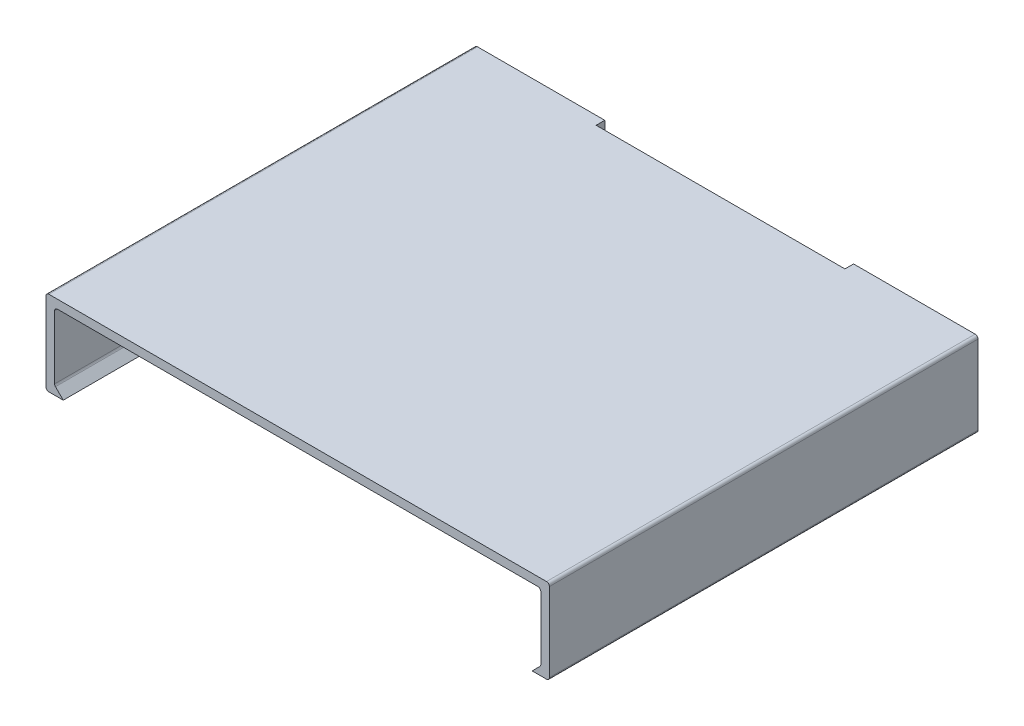
ISO-10303-21;
HEADER;
FILE_DESCRIPTION(('STEP AP214'),'2;1');
FILE_NAME('part.step','',(''),(''),'','','');
FILE_SCHEMA(('AUTOMOTIVE_DESIGN { 1 0 10303 214 1 1 1 1 }'));
ENDSEC;
DATA;
#1=APPLICATION_CONTEXT('core data for automotive mechanical design processes');
#2=APPLICATION_PROTOCOL_DEFINITION('international standard','automotive_design',2000,#1);
#3=PRODUCT_CONTEXT('',#1,'mechanical');
#4=PRODUCT('Part','Part','',(#3));
#5=PRODUCT_RELATED_PRODUCT_CATEGORY('part','',(#4));
#6=PRODUCT_DEFINITION_FORMATION('','',#4);
#7=PRODUCT_DEFINITION_CONTEXT('part definition',#1,'design');
#8=PRODUCT_DEFINITION('design','',#6,#7);
#9=PRODUCT_DEFINITION_SHAPE('','',#8);
#10=(LENGTH_UNIT() NAMED_UNIT(*) SI_UNIT(.MILLI.,.METRE.));
#11=(NAMED_UNIT(*) PLANE_ANGLE_UNIT() SI_UNIT($,.RADIAN.));
#12=(NAMED_UNIT(*) SI_UNIT($,.STERADIAN.) SOLID_ANGLE_UNIT());
#13=UNCERTAINTY_MEASURE_WITH_UNIT(LENGTH_MEASURE(1.E-05),#10,'distance_accuracy_value','');
#14=(GEOMETRIC_REPRESENTATION_CONTEXT(3) GLOBAL_UNCERTAINTY_ASSIGNED_CONTEXT((#13)) GLOBAL_UNIT_ASSIGNED_CONTEXT((#10,
#11,#12)) REPRESENTATION_CONTEXT('',''));
#15=CARTESIAN_POINT('',(0.,0.,0.));
#16=DIRECTION('',(0.,0.,1.));
#17=DIRECTION('',(1.,0.,0.));
#18=AXIS2_PLACEMENT_3D('',#15,#16,#17);
#19=CARTESIAN_POINT('',(18.3546894748456,10.8364269756994,74.5));
#20=DIRECTION('',(0.,1.,0.));
#21=DIRECTION('',(-1.,0.,0.));
#22=AXIS2_PLACEMENT_3D('',#19,#20,#21);
#23=PLANE('',#22);
#24=DIRECTION('',(1.,0.,0.));
#25=VECTOR('',#24,1.);
#26=CARTESIAN_POINT('',(18.3546894748456,10.8364269756994,0.));
#27=LINE('',#26,#25);
#28=CARTESIAN_POINT('',(-67.1453105251544,10.8364269756994,0.));
#29=VERTEX_POINT('',#28);
#30=CARTESIAN_POINT('',(-45.0203105251544,10.8364269756994,0.));
#31=VERTEX_POINT('',#30);
#32=EDGE_CURVE('E302',#29,#31,#27,.T.);
#33=ORIENTED_EDGE('',*,*,#32,.T.);
#34=DIRECTION('',(0.,0.,-1.));
#35=VECTOR('',#34,1.);
#36=CARTESIAN_POINT('',(-45.0203105251544,10.8364269756994,1.5));
#37=LINE('',#36,#35);
#38=CARTESIAN_POINT('',(-45.0203105251544,10.8364269756994,1.5));
#39=VERTEX_POINT('',#38);
#40=EDGE_CURVE('E218',#39,#31,#37,.T.);
#41=ORIENTED_EDGE('',*,*,#40,.F.);
#42=DIRECTION('',(1.,0.,0.));
#43=VECTOR('',#42,1.);
#44=CARTESIAN_POINT('',(-66.6453105251544,10.8364269756994,1.5));
#45=LINE('',#44,#43);
#46=CARTESIAN_POINT('',(-64.6453105251544,10.8364269756994,1.5));
#47=VERTEX_POINT('',#46);
#48=EDGE_CURVE('E226',#47,#39,#45,.T.);
#49=ORIENTED_EDGE('',*,*,#48,.F.);
#50=DIRECTION('',(0.,0.,-1.));
#51=VECTOR('',#50,1.);
#52=CARTESIAN_POINT('',(-64.6453105251544,10.8364269756994,74.5));
#53=LINE('',#52,#51);
#54=CARTESIAN_POINT('',(-64.6453105251544,10.8364269756994,74.5));
#55=VERTEX_POINT('',#54);
#56=EDGE_CURVE('E55',#55,#47,#53,.T.);
#57=ORIENTED_EDGE('',*,*,#56,.F.);
#58=DIRECTION('',(1.,0.,0.));
#59=VECTOR('',#58,1.);
#60=CARTESIAN_POINT('',(-66.1453105251544,10.8364269756994,74.5));
#61=LINE('',#60,#59);
#62=CARTESIAN_POINT('',(-67.1453105251544,10.8364269756994,74.5));
#63=VERTEX_POINT('',#62);
#64=EDGE_CURVE('E263',#63,#55,#61,.T.);
#65=ORIENTED_EDGE('',*,*,#64,.F.);
#66=DIRECTION('',(0.,0.,-1.));
#67=VECTOR('',#66,1.);
#68=CARTESIAN_POINT('',(-67.1453105251544,10.8364269756994,74.5));
#69=LINE('',#68,#67);
#70=EDGE_CURVE('E350',#63,#29,#69,.T.);
#71=ORIENTED_EDGE('',*,*,#70,.T.);
#72=EDGE_LOOP('',(#33,#41,#49,#57,#65,#71));
#73=FACE_BOUND('',#72,.T.);
#74=ADVANCED_FACE('F33',(#73),#23,.F.);
#75=CARTESIAN_POINT('',(19.3546894748456,25.0364269756994,0.));
#76=DIRECTION('',(0.,0.,1.));
#77=DIRECTION('',(1.,0.,0.));
#78=AXIS2_PLACEMENT_3D('',#75,#76,#77);
#79=PLANE('',#78);
#80=DIRECTION('',(-1.,0.,0.));
#81=VECTOR('',#80,1.);
#82=CARTESIAN_POINT('',(-66.1453105251544,25.5364269756994,0.));
#83=LINE('',#82,#81);
#84=CARTESIAN_POINT('',(-45.0203105251544,25.5364269756994,0.));
#85=VERTEX_POINT('',#84);
#86=CARTESIAN_POINT('',(-67.1453105251544,25.5364269756994,0.));
#87=VERTEX_POINT('',#86);
#88=EDGE_CURVE('E253',#85,#87,#83,.T.);
#89=ORIENTED_EDGE('',*,*,#88,.F.);
#90=DIRECTION('',(0.,1.,0.));
#91=VECTOR('',#90,1.);
#92=CARTESIAN_POINT('',(-45.0203105251544,10.8364269756994,0.));
#93=LINE('',#92,#91);
#94=EDGE_CURVE('E206',#31,#85,#93,.T.);
#95=ORIENTED_EDGE('',*,*,#94,.F.);
#96=ORIENTED_EDGE('',*,*,#32,.F.);
#97=CARTESIAN_POINT('',(-67.1453105251544,11.3364269756994,0.));
#98=DIRECTION('',(0.,0.,1.));
#99=DIRECTION('',(-1.,0.,0.));
#100=AXIS2_PLACEMENT_3D('',#97,#98,#99);
#101=CIRCLE('',#100,0.5);
#102=CARTESIAN_POINT('',(-67.6453105251544,11.3364269756994,0.));
#103=VERTEX_POINT('',#102);
#104=EDGE_CURVE('E298',#103,#29,#101,.T.);
#105=ORIENTED_EDGE('',*,*,#104,.F.);
#106=DIRECTION('',(0.,-1.,0.));
#107=VECTOR('',#106,1.);
#108=CARTESIAN_POINT('',(-67.6453105251544,25.0364269756994,0.));
#109=LINE('',#108,#107);
#110=CARTESIAN_POINT('',(-67.6453105251544,25.0364269756994,0.));
#111=VERTEX_POINT('',#110);
#112=EDGE_CURVE('E296',#111,#103,#109,.T.);
#113=ORIENTED_EDGE('',*,*,#112,.F.);
#114=CARTESIAN_POINT('',(-67.1453105251544,25.0364269756994,0.));
#115=DIRECTION('',(0.,0.,1.));
#116=DIRECTION('',(-1.,0.,0.));
#117=AXIS2_PLACEMENT_3D('',#114,#115,#116);
#118=CIRCLE('',#117,0.5);
#119=EDGE_CURVE('E294',#87,#111,#118,.T.);
#120=ORIENTED_EDGE('',*,*,#119,.F.);
#121=EDGE_LOOP('',(#89,#95,#96,#105,#113,#120));
#122=FACE_BOUND('',#121,.T.);
#123=ADVANCED_FACE('F368',(#122),#79,.F.);
#124=CARTESIAN_POINT('',(-66.6453105251544,10.8364269756994,1.5));
#125=DIRECTION('',(0.,0.,-1.));
#126=DIRECTION('',(-1.,0.,0.));
#127=AXIS2_PLACEMENT_3D('',#124,#125,#126);
#128=PLANE('',#127);
#129=ORIENTED_EDGE('',*,*,#48,.T.);
#130=DIRECTION('',(0.,1.,0.));
#131=VECTOR('',#130,1.);
#132=CARTESIAN_POINT('',(-45.0203105251544,10.8364269756994,1.5));
#133=LINE('',#132,#131);
#134=CARTESIAN_POINT('',(-45.0203105251544,24.0364269756994,1.5));
#135=VERTEX_POINT('',#134);
#136=EDGE_CURVE('E199',#39,#135,#133,.T.);
#137=ORIENTED_EDGE('',*,*,#136,.T.);
#138=DIRECTION('',(-1.,0.,0.));
#139=VECTOR('',#138,1.);
#140=CARTESIAN_POINT('',(-65.6453105251544,24.0364269756994,1.5));
#141=LINE('',#140,#139);
#142=CARTESIAN_POINT('',(-65.6453105251544,24.0364269756994,1.5));
#143=VERTEX_POINT('',#142);
#144=EDGE_CURVE('E238',#135,#143,#141,.T.);
#145=ORIENTED_EDGE('',*,*,#144,.T.);
#146=CARTESIAN_POINT('',(-65.6453105251544,23.5364269756994,1.5));
#147=DIRECTION('',(0.,0.,-1.));
#148=DIRECTION('',(-1.,0.,0.));
#149=AXIS2_PLACEMENT_3D('',#146,#147,#148);
#150=CIRCLE('',#149,0.5);
#151=CARTESIAN_POINT('',(-66.1453105251544,23.5364269756994,1.5));
#152=VERTEX_POINT('',#151);
#153=EDGE_CURVE('E242',#143,#152,#150,.F.);
#154=ORIENTED_EDGE('',*,*,#153,.T.);
#155=DIRECTION('',(0.,-1.,0.));
#156=VECTOR('',#155,1.);
#157=CARTESIAN_POINT('',(-66.1453105251544,23.5364269756994,1.5));
#158=LINE('',#157,#156);
#159=CARTESIAN_POINT('',(-66.1453105251544,12.543533756886,1.5));
#160=VERTEX_POINT('',#159);
#161=EDGE_CURVE('E245',#152,#160,#158,.T.);
#162=ORIENTED_EDGE('',*,*,#161,.T.);
#163=CARTESIAN_POINT('',(-65.6453105251544,12.543533756886,1.5));
#164=DIRECTION('',(0.,0.,-1.));
#165=DIRECTION('',(-1.,0.,0.));
#166=AXIS2_PLACEMENT_3D('',#163,#164,#165);
#167=CIRCLE('',#166,0.5);
#168=CARTESIAN_POINT('',(-65.9988639157477,12.1899803662927,1.5));
#169=VERTEX_POINT('',#168);
#170=EDGE_CURVE('E248',#160,#169,#167,.F.);
#171=ORIENTED_EDGE('',*,*,#170,.T.);
#172=DIRECTION('',(0.707106781186551,-0.707106781186544,0.));
#173=VECTOR('',#172,1.);
#174=CARTESIAN_POINT('',(-64.6453105251544,10.8364269756994,1.5));
#175=LINE('',#174,#173);
#176=EDGE_CURVE('E251',#169,#47,#175,.T.);
#177=ORIENTED_EDGE('',*,*,#176,.T.);
#178=EDGE_LOOP('',(#129,#137,#145,#154,#162,#171,#177));
#179=FACE_BOUND('',#178,.T.);
#180=ADVANCED_FACE('F425',(#179),#128,.F.);
#181=CARTESIAN_POINT('',(-64.6453105251544,10.8364269756994,74.5));
#182=DIRECTION('',(-0.707106781186544,-0.707106781186551,0.));
#183=DIRECTION('',(0.707106781186551,-0.707106781186544,0.));
#184=AXIS2_PLACEMENT_3D('',#181,#182,#183);
#185=PLANE('',#184);
#186=ORIENTED_EDGE('',*,*,#176,.F.);
#187=DIRECTION('',(0.,0.,-1.));
#188=VECTOR('',#187,1.);
#189=CARTESIAN_POINT('',(-65.9988639157477,12.1899803662927,74.5));
#190=LINE('',#189,#188);
#191=CARTESIAN_POINT('',(-65.9988639157477,12.1899803662927,74.5));
#192=VERTEX_POINT('',#191);
#193=EDGE_CURVE('E346',#192,#169,#190,.T.);
#194=ORIENTED_EDGE('',*,*,#193,.F.);
#195=DIRECTION('',(-0.707106781186551,0.707106781186544,0.));
#196=VECTOR('',#195,1.);
#197=CARTESIAN_POINT('',(-64.6453105251544,10.8364269756994,74.5));
#198=LINE('',#197,#196);
#199=EDGE_CURVE('E265',#55,#192,#198,.T.);
#200=ORIENTED_EDGE('',*,*,#199,.F.);
#201=ORIENTED_EDGE('',*,*,#56,.T.);
#202=EDGE_LOOP('',(#186,#194,#200,#201));
#203=FACE_BOUND('',#202,.T.);
#204=ADVANCED_FACE('F440',(#203),#185,.F.);
#205=CARTESIAN_POINT('',(-65.6453105251544,12.543533756886,74.5));
#206=DIRECTION('',(0.,0.,-1.));
#207=DIRECTION('',(-1.,0.,0.));
#208=AXIS2_PLACEMENT_3D('',#205,#206,#207);
#209=CYLINDRICAL_SURFACE('',#208,0.5);
#210=ORIENTED_EDGE('',*,*,#170,.F.);
#211=DIRECTION('',(0.,0.,-1.));
#212=VECTOR('',#211,1.);
#213=CARTESIAN_POINT('',(-66.1453105251544,12.543533756886,74.5));
#214=LINE('',#213,#212);
#215=CARTESIAN_POINT('',(-66.1453105251544,12.543533756886,74.5));
#216=VERTEX_POINT('',#215);
#217=EDGE_CURVE('E343',#216,#160,#214,.T.);
#218=ORIENTED_EDGE('',*,*,#217,.F.);
#219=CARTESIAN_POINT('',(-65.6453105251544,12.543533756886,74.5));
#220=DIRECTION('',(0.,0.,-1.));
#221=DIRECTION('',(-1.,0.,0.));
#222=AXIS2_PLACEMENT_3D('',#219,#220,#221);
#223=CIRCLE('',#222,0.5);
#224=EDGE_CURVE('E267',#192,#216,#223,.T.);
#225=ORIENTED_EDGE('',*,*,#224,.F.);
#226=ORIENTED_EDGE('',*,*,#193,.T.);
#227=EDGE_LOOP('',(#210,#218,#225,#226));
#228=FACE_BOUND('',#227,.T.);
#229=ADVANCED_FACE('F437',(#228),#209,.F.);
#230=CARTESIAN_POINT('',(-66.1453105251544,23.5364269756994,74.5));
#231=DIRECTION('',(-1.,0.,0.));
#232=DIRECTION('',(0.,0.,1.));
#233=AXIS2_PLACEMENT_3D('',#230,#231,#232);
#234=PLANE('',#233);
#235=ORIENTED_EDGE('',*,*,#161,.F.);
#236=DIRECTION('',(0.,0.,-1.));
#237=VECTOR('',#236,1.);
#238=CARTESIAN_POINT('',(-66.1453105251544,23.5364269756994,74.5));
#239=LINE('',#238,#237);
#240=CARTESIAN_POINT('',(-66.1453105251544,23.5364269756994,74.5));
#241=VERTEX_POINT('',#240);
#242=EDGE_CURVE('E340',#241,#152,#239,.T.);
#243=ORIENTED_EDGE('',*,*,#242,.F.);
#244=DIRECTION('',(0.,1.,0.));
#245=VECTOR('',#244,1.);
#246=CARTESIAN_POINT('',(-66.1453105251544,23.5364269756994,74.5));
#247=LINE('',#246,#245);
#248=EDGE_CURVE('E269',#216,#241,#247,.T.);
#249=ORIENTED_EDGE('',*,*,#248,.F.);
#250=ORIENTED_EDGE('',*,*,#217,.T.);
#251=EDGE_LOOP('',(#235,#243,#249,#250));
#252=FACE_BOUND('',#251,.T.);
#253=ADVANCED_FACE('F433',(#252),#234,.F.);
#254=CARTESIAN_POINT('',(-65.6453105251544,23.5364269756994,74.5));
#255=DIRECTION('',(0.,0.,-1.));
#256=DIRECTION('',(-1.,0.,0.));
#257=AXIS2_PLACEMENT_3D('',#254,#255,#256);
#258=CYLINDRICAL_SURFACE('',#257,0.5);
#259=ORIENTED_EDGE('',*,*,#153,.F.);
#260=DIRECTION('',(0.,0.,-1.));
#261=VECTOR('',#260,1.);
#262=CARTESIAN_POINT('',(-65.6453105251544,24.0364269756994,74.5));
#263=LINE('',#262,#261);
#264=CARTESIAN_POINT('',(-65.6453105251544,24.0364269756994,74.5));
#265=VERTEX_POINT('',#264);
#266=EDGE_CURVE('E337',#265,#143,#263,.T.);
#267=ORIENTED_EDGE('',*,*,#266,.F.);
#268=CARTESIAN_POINT('',(-65.6453105251544,23.5364269756994,74.5));
#269=DIRECTION('',(0.,0.,-1.));
#270=DIRECTION('',(-1.,0.,0.));
#271=AXIS2_PLACEMENT_3D('',#268,#269,#270);
#272=CIRCLE('',#271,0.5);
#273=EDGE_CURVE('E271',#241,#265,#272,.T.);
#274=ORIENTED_EDGE('',*,*,#273,.F.);
#275=ORIENTED_EDGE('',*,*,#242,.T.);
#276=EDGE_LOOP('',(#259,#267,#274,#275));
#277=FACE_BOUND('',#276,.T.);
#278=ADVANCED_FACE('F428',(#277),#258,.F.);
#279=CARTESIAN_POINT('',(-65.6453105251544,24.0364269756994,74.5));
#280=DIRECTION('',(0.,1.,0.));
#281=DIRECTION('',(0.,0.,1.));
#282=AXIS2_PLACEMENT_3D('',#279,#280,#281);
#283=PLANE('',#282);
#284=CARTESIAN_POINT('',(17.8546894748456,24.0364269756994,1.5));
#285=VERTEX_POINT('',#284);
#286=CARTESIAN_POINT('',(-1.77031052515439,24.0364269756994,1.5));
#287=VERTEX_POINT('',#286);
#288=EDGE_CURVE('E239',#285,#287,#141,.T.);
#289=ORIENTED_EDGE('',*,*,#288,.F.);
#290=DIRECTION('',(0.,0.,-1.));
#291=VECTOR('',#290,1.);
#292=CARTESIAN_POINT('',(17.8546894748456,24.0364269756994,74.5));
#293=LINE('',#292,#291);
#294=CARTESIAN_POINT('',(17.8546894748456,24.0364269756994,74.5));
#295=VERTEX_POINT('',#294);
#296=EDGE_CURVE('E334',#295,#285,#293,.T.);
#297=ORIENTED_EDGE('',*,*,#296,.F.);
#298=DIRECTION('',(1.,0.,0.));
#299=VECTOR('',#298,1.);
#300=CARTESIAN_POINT('',(-65.6453105251544,24.0364269756994,74.5));
#301=LINE('',#300,#299);
#302=EDGE_CURVE('E273',#265,#295,#301,.T.);
#303=ORIENTED_EDGE('',*,*,#302,.F.);
#304=ORIENTED_EDGE('',*,*,#266,.T.);
#305=ORIENTED_EDGE('',*,*,#144,.F.);
#306=EDGE_CURVE('E196',#287,#135,#141,.T.);
#307=ORIENTED_EDGE('',*,*,#306,.F.);
#308=EDGE_LOOP('',(#289,#297,#303,#304,#305,#307));
#309=FACE_BOUND('',#308,.T.);
#310=ADVANCED_FACE('F421',(#309),#283,.F.);
#311=CARTESIAN_POINT('',(17.8546894748456,23.5364269756994,74.5));
#312=DIRECTION('',(0.,0.,-1.));
#313=DIRECTION('',(-1.,0.,0.));
#314=AXIS2_PLACEMENT_3D('',#311,#312,#313);
#315=CYLINDRICAL_SURFACE('',#314,0.5);
#316=CARTESIAN_POINT('',(17.8546894748456,23.5364269756994,1.5));
#317=DIRECTION('',(0.,0.,-1.));
#318=DIRECTION('',(-1.,0.,0.));
#319=AXIS2_PLACEMENT_3D('',#316,#317,#318);
#320=CIRCLE('',#319,0.5);
#321=CARTESIAN_POINT('',(18.3546894748456,23.5364269756994,1.5));
#322=VERTEX_POINT('',#321);
#323=EDGE_CURVE('E235',#322,#285,#320,.F.);
#324=ORIENTED_EDGE('',*,*,#323,.F.);
#325=DIRECTION('',(0.,0.,-1.));
#326=VECTOR('',#325,1.);
#327=CARTESIAN_POINT('',(18.3546894748456,23.5364269756994,74.5));
#328=LINE('',#327,#326);
#329=CARTESIAN_POINT('',(18.3546894748456,23.5364269756994,74.5));
#330=VERTEX_POINT('',#329);
#331=EDGE_CURVE('E331',#330,#322,#328,.T.);
#332=ORIENTED_EDGE('',*,*,#331,.F.);
#333=CARTESIAN_POINT('',(17.8546894748456,23.5364269756994,74.5));
#334=DIRECTION('',(0.,0.,-1.));
#335=DIRECTION('',(-1.,0.,0.));
#336=AXIS2_PLACEMENT_3D('',#333,#334,#335);
#337=CIRCLE('',#336,0.5);
#338=EDGE_CURVE('E275',#295,#330,#337,.T.);
#339=ORIENTED_EDGE('',*,*,#338,.F.);
#340=ORIENTED_EDGE('',*,*,#296,.T.);
#341=EDGE_LOOP('',(#324,#332,#339,#340));
#342=FACE_BOUND('',#341,.T.);
#343=ADVANCED_FACE('F417',(#342),#315,.F.);
#344=CARTESIAN_POINT('',(18.3546894748456,23.5364269756994,74.5));
#345=DIRECTION('',(1.,0.,0.));
#346=DIRECTION('',(0.,1.,0.));
#347=AXIS2_PLACEMENT_3D('',#344,#345,#346);
#348=PLANE('',#347);
#349=DIRECTION('',(0.,1.,0.));
#350=VECTOR('',#349,1.);
#351=CARTESIAN_POINT('',(18.3546894748456,10.8364269756995,1.5));
#352=LINE('',#351,#350);
#353=CARTESIAN_POINT('',(18.3546894748456,12.543533756886,1.5));
#354=VERTEX_POINT('',#353);
#355=EDGE_CURVE('E220',#354,#322,#352,.T.);
#356=ORIENTED_EDGE('',*,*,#355,.F.);
#357=DIRECTION('',(0.,0.,-1.));
#358=VECTOR('',#357,1.);
#359=CARTESIAN_POINT('',(18.3546894748456,12.543533756886,74.5));
#360=LINE('',#359,#358);
#361=CARTESIAN_POINT('',(18.3546894748456,12.543533756886,74.5));
#362=VERTEX_POINT('',#361);
#363=EDGE_CURVE('E328',#362,#354,#360,.T.);
#364=ORIENTED_EDGE('',*,*,#363,.F.);
#365=DIRECTION('',(0.,-1.,0.));
#366=VECTOR('',#365,1.);
#367=CARTESIAN_POINT('',(18.3546894748456,23.5364269756994,74.5));
#368=LINE('',#367,#366);
#369=EDGE_CURVE('E277',#330,#362,#368,.T.);
#370=ORIENTED_EDGE('',*,*,#369,.F.);
#371=ORIENTED_EDGE('',*,*,#331,.T.);
#372=EDGE_LOOP('',(#356,#364,#370,#371));
#373=FACE_BOUND('',#372,.T.);
#374=ADVANCED_FACE('F412',(#373),#348,.F.);
#375=CARTESIAN_POINT('',(17.8546894748456,12.543533756886,74.5));
#376=DIRECTION('',(0.,0.,-1.));
#377=DIRECTION('',(-1.,0.,0.));
#378=AXIS2_PLACEMENT_3D('',#375,#376,#377);
#379=CYLINDRICAL_SURFACE('',#378,0.500000000000002);
#380=CARTESIAN_POINT('',(17.8546894748456,12.543533756886,1.5));
#381=DIRECTION('',(0.,0.,-1.));
#382=DIRECTION('',(-1.,0.,0.));
#383=AXIS2_PLACEMENT_3D('',#380,#381,#382);
#384=CIRCLE('',#383,0.500000000000002);
#385=CARTESIAN_POINT('',(18.2082428654389,12.1899803662927,1.5));
#386=VERTEX_POINT('',#385);
#387=EDGE_CURVE('E232',#386,#354,#384,.F.);
#388=ORIENTED_EDGE('',*,*,#387,.F.);
#389=DIRECTION('',(0.,0.,-1.));
#390=VECTOR('',#389,1.);
#391=CARTESIAN_POINT('',(18.2082428654389,12.1899803662927,74.5));
#392=LINE('',#391,#390);
#393=CARTESIAN_POINT('',(18.2082428654389,12.1899803662927,74.5));
#394=VERTEX_POINT('',#393);
#395=EDGE_CURVE('E325',#394,#386,#392,.T.);
#396=ORIENTED_EDGE('',*,*,#395,.F.);
#397=CARTESIAN_POINT('',(17.8546894748456,12.543533756886,74.5));
#398=DIRECTION('',(0.,0.,-1.));
#399=DIRECTION('',(1.,0.,0.));
#400=AXIS2_PLACEMENT_3D('',#397,#398,#399);
#401=CIRCLE('',#400,0.500000000000002);
#402=EDGE_CURVE('E279',#362,#394,#401,.T.);
#403=ORIENTED_EDGE('',*,*,#402,.F.);
#404=ORIENTED_EDGE('',*,*,#363,.T.);
#405=EDGE_LOOP('',(#388,#396,#403,#404));
#406=FACE_BOUND('',#405,.T.);
#407=ADVANCED_FACE('F409',(#406),#379,.F.);
#408=CARTESIAN_POINT('',(16.8546894748456,10.8364269756994,74.5));
#409=DIRECTION('',(0.70710678118655,-0.707106781186545,0.));
#410=DIRECTION('',(0.707106781186545,0.70710678118655,0.));
#411=AXIS2_PLACEMENT_3D('',#408,#409,#410);
#412=PLANE('',#411);
#413=DIRECTION('',(0.707106781186545,0.70710678118655,0.));
#414=VECTOR('',#413,1.);
#415=CARTESIAN_POINT('',(16.8546894748456,10.8364269756994,1.5));
#416=LINE('',#415,#414);
#417=CARTESIAN_POINT('',(16.8546894748456,10.8364269756994,1.5));
#418=VERTEX_POINT('',#417);
#419=EDGE_CURVE('E229',#418,#386,#416,.T.);
#420=ORIENTED_EDGE('',*,*,#419,.F.);
#421=DIRECTION('',(0.,0.,-1.));
#422=VECTOR('',#421,1.);
#423=CARTESIAN_POINT('',(16.8546894748456,10.8364269756994,74.5));
#424=LINE('',#423,#422);
#425=CARTESIAN_POINT('',(16.8546894748456,10.8364269756994,74.5));
#426=VERTEX_POINT('',#425);
#427=EDGE_CURVE('E322',#426,#418,#424,.T.);
#428=ORIENTED_EDGE('',*,*,#427,.F.);
#429=DIRECTION('',(-0.707106781186545,-0.70710678118655,0.));
#430=VECTOR('',#429,1.);
#431=CARTESIAN_POINT('',(16.8546894748456,10.8364269756994,74.5));
#432=LINE('',#431,#430);
#433=EDGE_CURVE('E281',#394,#426,#432,.T.);
#434=ORIENTED_EDGE('',*,*,#433,.F.);
#435=ORIENTED_EDGE('',*,*,#395,.T.);
#436=EDGE_LOOP('',(#420,#428,#434,#435));
#437=FACE_BOUND('',#436,.T.);
#438=ADVANCED_FACE('F404',(#437),#412,.F.);
#439=CARTESIAN_POINT('',(-66.1453105251544,25.5364269756994,74.5));
#440=DIRECTION('',(0.,-1.,0.));
#441=DIRECTION('',(0.,0.,-1.));
#442=AXIS2_PLACEMENT_3D('',#439,#440,#441);
#443=PLANE('',#442);
#444=DIRECTION('',(1.,0.,0.));
#445=VECTOR('',#444,1.);
#446=CARTESIAN_POINT('',(-45.0203105251544,25.5364269756994,1.5));
#447=LINE('',#446,#445);
#448=CARTESIAN_POINT('',(-45.0203105251544,25.5364269756994,1.5));
#449=VERTEX_POINT('',#448);
#450=CARTESIAN_POINT('',(-1.77031052515439,25.5364269756994,1.5));
#451=VERTEX_POINT('',#450);
#452=EDGE_CURVE('E193',#449,#451,#447,.T.);
#453=ORIENTED_EDGE('',*,*,#452,.F.);
#454=DIRECTION('',(0.,0.,-1.));
#455=VECTOR('',#454,1.);
#456=CARTESIAN_POINT('',(-45.0203105251544,25.5364269756994,1.5));
#457=LINE('',#456,#455);
#458=EDGE_CURVE('E203',#449,#85,#457,.T.);
#459=ORIENTED_EDGE('',*,*,#458,.T.);
#460=ORIENTED_EDGE('',*,*,#88,.T.);
#461=DIRECTION('',(0.,0.,-1.));
#462=VECTOR('',#461,1.);
#463=CARTESIAN_POINT('',(-67.1453105251544,25.5364269756994,74.5));
#464=LINE('',#463,#462);
#465=CARTESIAN_POINT('',(-67.1453105251544,25.5364269756994,74.5));
#466=VERTEX_POINT('',#465);
#467=EDGE_CURVE('E41',#466,#87,#464,.T.);
#468=ORIENTED_EDGE('',*,*,#467,.F.);
#469=DIRECTION('',(-1.,0.,0.));
#470=VECTOR('',#469,1.);
#471=CARTESIAN_POINT('',(18.3546894748456,25.5364269756994,74.5));
#472=LINE('',#471,#470);
#473=CARTESIAN_POINT('',(19.3546894748456,25.5364269756994,74.5));
#474=VERTEX_POINT('',#473);
#475=EDGE_CURVE('E254',#474,#466,#472,.T.);
#476=ORIENTED_EDGE('',*,*,#475,.F.);
#477=DIRECTION('',(0.,0.,-1.));
#478=VECTOR('',#477,1.);
#479=CARTESIAN_POINT('',(19.3546894748456,25.5364269756994,74.5));
#480=LINE('',#479,#478);
#481=CARTESIAN_POINT('',(19.3546894748456,25.5364269756994,0.));
#482=VERTEX_POINT('',#481);
#483=EDGE_CURVE('E291',#474,#482,#480,.T.);
#484=ORIENTED_EDGE('',*,*,#483,.T.);
#485=CARTESIAN_POINT('',(-1.77031052515439,25.5364269756994,0.));
#486=VERTEX_POINT('',#485);
#487=EDGE_CURVE('E292',#482,#486,#83,.T.);
#488=ORIENTED_EDGE('',*,*,#487,.T.);
#489=DIRECTION('',(0.,0.,-1.));
#490=VECTOR('',#489,1.);
#491=CARTESIAN_POINT('',(-1.77031052515439,25.5364269756994,1.5));
#492=LINE('',#491,#490);
#493=EDGE_CURVE('E209',#451,#486,#492,.T.);
#494=ORIENTED_EDGE('',*,*,#493,.F.);
#495=EDGE_LOOP('',(#453,#459,#460,#468,#476,#484,#488,#494));
#496=FACE_BOUND('',#495,.T.);
#497=ADVANCED_FACE('F35',(#496),#443,.F.);
#498=CARTESIAN_POINT('',(-67.1453105251544,25.0364269756994,74.5));
#499=DIRECTION('',(0.,0.,-1.));
#500=DIRECTION('',(-1.,0.,0.));
#501=AXIS2_PLACEMENT_3D('',#498,#499,#500);
#502=CYLINDRICAL_SURFACE('',#501,0.5);
#503=ORIENTED_EDGE('',*,*,#119,.T.);
#504=DIRECTION('',(0.,0.,-1.));
#505=VECTOR('',#504,1.);
#506=CARTESIAN_POINT('',(-67.6453105251544,25.0364269756994,74.5));
#507=LINE('',#506,#505);
#508=CARTESIAN_POINT('',(-67.6453105251544,25.0364269756994,74.5));
#509=VERTEX_POINT('',#508);
#510=EDGE_CURVE('E356',#509,#111,#507,.T.);
#511=ORIENTED_EDGE('',*,*,#510,.F.);
#512=CARTESIAN_POINT('',(-67.1453105251544,25.0364269756994,74.5));
#513=DIRECTION('',(0.,0.,1.));
#514=DIRECTION('',(-1.,0.,0.));
#515=AXIS2_PLACEMENT_3D('',#512,#513,#514);
#516=CIRCLE('',#515,0.5);
#517=EDGE_CURVE('E256',#466,#509,#516,.T.);
#518=ORIENTED_EDGE('',*,*,#517,.F.);
#519=ORIENTED_EDGE('',*,*,#467,.T.);
#520=EDGE_LOOP('',(#503,#511,#518,#519));
#521=FACE_BOUND('',#520,.T.);
#522=ADVANCED_FACE('F363',(#521),#502,.T.);
#523=CARTESIAN_POINT('',(-67.6453105251544,25.0364269756994,74.5));
#524=DIRECTION('',(1.,0.,0.));
#525=DIRECTION('',(0.,0.,-1.));
#526=AXIS2_PLACEMENT_3D('',#523,#524,#525);
#527=PLANE('',#526);
#528=ORIENTED_EDGE('',*,*,#112,.T.);
#529=DIRECTION('',(0.,0.,-1.));
#530=VECTOR('',#529,1.);
#531=CARTESIAN_POINT('',(-67.6453105251544,11.3364269756994,74.5));
#532=LINE('',#531,#530);
#533=CARTESIAN_POINT('',(-67.6453105251544,11.3364269756994,74.5));
#534=VERTEX_POINT('',#533);
#535=EDGE_CURVE('E353',#534,#103,#532,.T.);
#536=ORIENTED_EDGE('',*,*,#535,.F.);
#537=DIRECTION('',(0.,-1.,0.));
#538=VECTOR('',#537,1.);
#539=CARTESIAN_POINT('',(-67.6453105251544,25.0364269756994,74.5));
#540=LINE('',#539,#538);
#541=EDGE_CURVE('E259',#509,#534,#540,.T.);
#542=ORIENTED_EDGE('',*,*,#541,.F.);
#543=ORIENTED_EDGE('',*,*,#510,.T.);
#544=EDGE_LOOP('',(#528,#536,#542,#543));
#545=FACE_BOUND('',#544,.T.);
#546=ADVANCED_FACE('F372',(#545),#527,.F.);
#547=CARTESIAN_POINT('',(-67.1453105251544,11.3364269756994,74.5));
#548=DIRECTION('',(0.,0.,-1.));
#549=DIRECTION('',(-1.,0.,0.));
#550=AXIS2_PLACEMENT_3D('',#547,#548,#549);
#551=CYLINDRICAL_SURFACE('',#550,0.5);
#552=ORIENTED_EDGE('',*,*,#104,.T.);
#553=ORIENTED_EDGE('',*,*,#70,.F.);
#554=CARTESIAN_POINT('',(-67.1453105251544,11.3364269756994,74.5));
#555=DIRECTION('',(0.,0.,1.));
#556=DIRECTION('',(-1.,0.,0.));
#557=AXIS2_PLACEMENT_3D('',#554,#555,#556);
#558=CIRCLE('',#557,0.5);
#559=EDGE_CURVE('E261',#534,#63,#558,.T.);
#560=ORIENTED_EDGE('',*,*,#559,.F.);
#561=ORIENTED_EDGE('',*,*,#535,.T.);
#562=EDGE_LOOP('',(#552,#553,#560,#561));
#563=FACE_BOUND('',#562,.T.);
#564=ADVANCED_FACE('F376',(#563),#551,.T.);
#565=CARTESIAN_POINT('',(-1.77031052515439,10.8364269756995,1.5));
#566=VERTEX_POINT('',#565);
#567=EDGE_CURVE('E225',#566,#418,#45,.T.);
#568=ORIENTED_EDGE('',*,*,#567,.F.);
#569=DIRECTION('',(0.,0.,-1.));
#570=VECTOR('',#569,1.);
#571=CARTESIAN_POINT('',(-1.77031052515439,10.8364269756994,1.5));
#572=LINE('',#571,#570);
#573=CARTESIAN_POINT('',(-1.77031052515439,10.8364269756994,0.));
#574=VERTEX_POINT('',#573);
#575=EDGE_CURVE('E48',#566,#574,#572,.T.);
#576=ORIENTED_EDGE('',*,*,#575,.T.);
#577=CARTESIAN_POINT('',(19.3546894748456,10.8364269756994,0.));
#578=VERTEX_POINT('',#577);
#579=EDGE_CURVE('E301',#574,#578,#27,.T.);
#580=ORIENTED_EDGE('',*,*,#579,.T.);
#581=DIRECTION('',(0.,0.,-1.));
#582=VECTOR('',#581,1.);
#583=CARTESIAN_POINT('',(19.3546894748456,10.8364269756994,74.5));
#584=LINE('',#583,#582);
#585=CARTESIAN_POINT('',(19.3546894748456,10.8364269756994,74.5));
#586=VERTEX_POINT('',#585);
#587=EDGE_CURVE('E319',#586,#578,#584,.T.);
#588=ORIENTED_EDGE('',*,*,#587,.F.);
#589=DIRECTION('',(1.,0.,0.));
#590=VECTOR('',#589,1.);
#591=CARTESIAN_POINT('',(18.3546894748456,10.8364269756994,74.5));
#592=LINE('',#591,#590);
#593=EDGE_CURVE('E283',#426,#586,#592,.T.);
#594=ORIENTED_EDGE('',*,*,#593,.F.);
#595=ORIENTED_EDGE('',*,*,#427,.T.);
#596=EDGE_LOOP('',(#568,#576,#580,#588,#594,#595));
#597=FACE_BOUND('',#596,.T.);
#598=ADVANCED_FACE('F396',(#597),#23,.F.);
#599=CARTESIAN_POINT('',(19.3546894748456,11.3364269756994,74.5));
#600=DIRECTION('',(0.,0.,-1.));
#601=DIRECTION('',(-1.,0.,0.));
#602=AXIS2_PLACEMENT_3D('',#599,#600,#601);
#603=CYLINDRICAL_SURFACE('',#602,0.5);
#604=CARTESIAN_POINT('',(19.3546894748456,11.3364269756994,0.));
#605=DIRECTION('',(0.,0.,1.));
#606=DIRECTION('',(1.,0.,0.));
#607=AXIS2_PLACEMENT_3D('',#604,#605,#606);
#608=CIRCLE('',#607,0.5);
#609=CARTESIAN_POINT('',(19.8546894748456,11.3364269756994,0.));
#610=VERTEX_POINT('',#609);
#611=EDGE_CURVE('E305',#578,#610,#608,.T.);
#612=ORIENTED_EDGE('',*,*,#611,.T.);
#613=DIRECTION('',(0.,0.,-1.));
#614=VECTOR('',#613,1.);
#615=CARTESIAN_POINT('',(19.8546894748456,11.3364269756994,74.5));
#616=LINE('',#615,#614);
#617=CARTESIAN_POINT('',(19.8546894748456,11.3364269756994,74.5));
#618=VERTEX_POINT('',#617);
#619=EDGE_CURVE('E316',#618,#610,#616,.T.);
#620=ORIENTED_EDGE('',*,*,#619,.F.);
#621=CARTESIAN_POINT('',(19.3546894748456,11.3364269756994,74.5));
#622=DIRECTION('',(0.,0.,1.));
#623=DIRECTION('',(1.,0.,0.));
#624=AXIS2_PLACEMENT_3D('',#621,#622,#623);
#625=CIRCLE('',#624,0.5);
#626=EDGE_CURVE('E285',#586,#618,#625,.T.);
#627=ORIENTED_EDGE('',*,*,#626,.F.);
#628=ORIENTED_EDGE('',*,*,#587,.T.);
#629=EDGE_LOOP('',(#612,#620,#627,#628));
#630=FACE_BOUND('',#629,.T.);
#631=ADVANCED_FACE('F444',(#630),#603,.T.);
#632=CARTESIAN_POINT('',(19.8546894748456,25.0364269756994,74.5));
#633=DIRECTION('',(-1.,0.,0.));
#634=DIRECTION('',(0.,-1.,0.));
#635=AXIS2_PLACEMENT_3D('',#632,#633,#634);
#636=PLANE('',#635);
#637=DIRECTION('',(0.,1.,0.));
#638=VECTOR('',#637,1.);
#639=CARTESIAN_POINT('',(19.8546894748456,25.0364269756994,0.));
#640=LINE('',#639,#638);
#641=CARTESIAN_POINT('',(19.8546894748456,25.0364269756994,0.));
#642=VERTEX_POINT('',#641);
#643=EDGE_CURVE('E307',#610,#642,#640,.T.);
#644=ORIENTED_EDGE('',*,*,#643,.T.);
#645=DIRECTION('',(0.,0.,-1.));
#646=VECTOR('',#645,1.);
#647=CARTESIAN_POINT('',(19.8546894748456,25.0364269756994,74.5));
#648=LINE('',#647,#646);
#649=CARTESIAN_POINT('',(19.8546894748456,25.0364269756994,74.5));
#650=VERTEX_POINT('',#649);
#651=EDGE_CURVE('E313',#650,#642,#648,.T.);
#652=ORIENTED_EDGE('',*,*,#651,.F.);
#653=DIRECTION('',(0.,1.,0.));
#654=VECTOR('',#653,1.);
#655=CARTESIAN_POINT('',(19.8546894748456,25.0364269756994,74.5));
#656=LINE('',#655,#654);
#657=EDGE_CURVE('E287',#618,#650,#656,.T.);
#658=ORIENTED_EDGE('',*,*,#657,.F.);
#659=ORIENTED_EDGE('',*,*,#619,.T.);
#660=EDGE_LOOP('',(#644,#652,#658,#659));
#661=FACE_BOUND('',#660,.T.);
#662=ADVANCED_FACE('F447',(#661),#636,.F.);
#663=CARTESIAN_POINT('',(19.3546894748456,25.0364269756994,74.5));
#664=DIRECTION('',(0.,0.,-1.));
#665=DIRECTION('',(-1.,0.,0.));
#666=AXIS2_PLACEMENT_3D('',#663,#664,#665);
#667=CYLINDRICAL_SURFACE('',#666,0.5);
#668=CARTESIAN_POINT('',(19.3546894748456,25.0364269756994,0.));
#669=DIRECTION('',(0.,0.,1.));
#670=DIRECTION('',(1.,0.,0.));
#671=AXIS2_PLACEMENT_3D('',#668,#669,#670);
#672=CIRCLE('',#671,0.5);
#673=EDGE_CURVE('E257',#642,#482,#672,.T.);
#674=ORIENTED_EDGE('',*,*,#673,.T.);
#675=ORIENTED_EDGE('',*,*,#483,.F.);
#676=CARTESIAN_POINT('',(19.3546894748456,25.0364269756994,74.5));
#677=DIRECTION('',(0.,0.,1.));
#678=DIRECTION('',(1.,0.,0.));
#679=AXIS2_PLACEMENT_3D('',#676,#677,#678);
#680=CIRCLE('',#679,0.5);
#681=EDGE_CURVE('E289',#650,#474,#680,.T.);
#682=ORIENTED_EDGE('',*,*,#681,.F.);
#683=ORIENTED_EDGE('',*,*,#651,.T.);
#684=EDGE_LOOP('',(#674,#675,#682,#683));
#685=FACE_BOUND('',#684,.T.);
#686=ADVANCED_FACE('F384',(#685),#667,.T.);
#687=CARTESIAN_POINT('',(19.3546894748456,25.0364269756994,74.5));
#688=DIRECTION('',(0.,0.,1.));
#689=DIRECTION('',(1.,0.,0.));
#690=AXIS2_PLACEMENT_3D('',#687,#688,#689);
#691=PLANE('',#690);
#692=ORIENTED_EDGE('',*,*,#475,.T.);
#693=ORIENTED_EDGE('',*,*,#517,.T.);
#694=ORIENTED_EDGE('',*,*,#541,.T.);
#695=ORIENTED_EDGE('',*,*,#559,.T.);
#696=ORIENTED_EDGE('',*,*,#64,.T.);
#697=ORIENTED_EDGE('',*,*,#199,.T.);
#698=ORIENTED_EDGE('',*,*,#224,.T.);
#699=ORIENTED_EDGE('',*,*,#248,.T.);
#700=ORIENTED_EDGE('',*,*,#273,.T.);
#701=ORIENTED_EDGE('',*,*,#302,.T.);
#702=ORIENTED_EDGE('',*,*,#338,.T.);
#703=ORIENTED_EDGE('',*,*,#369,.T.);
#704=ORIENTED_EDGE('',*,*,#402,.T.);
#705=ORIENTED_EDGE('',*,*,#433,.T.);
#706=ORIENTED_EDGE('',*,*,#593,.T.);
#707=ORIENTED_EDGE('',*,*,#626,.T.);
#708=ORIENTED_EDGE('',*,*,#657,.T.);
#709=ORIENTED_EDGE('',*,*,#681,.T.);
#710=EDGE_LOOP('',(#692,#693,#694,#695,#696,#697,#698,#699,#700,#701,#702,#703,#704,#705,#706,
#707,#708,#709));
#711=FACE_BOUND('',#710,.T.);
#712=ADVANCED_FACE('F380',(#711),#691,.T.);
#713=ORIENTED_EDGE('',*,*,#579,.F.);
#714=DIRECTION('',(0.,-1.,0.));
#715=VECTOR('',#714,1.);
#716=CARTESIAN_POINT('',(-1.77031052515439,10.8364269756994,0.));
#717=LINE('',#716,#715);
#718=EDGE_CURVE('E200',#486,#574,#717,.T.);
#719=ORIENTED_EDGE('',*,*,#718,.F.);
#720=ORIENTED_EDGE('',*,*,#487,.F.);
#721=ORIENTED_EDGE('',*,*,#673,.F.);
#722=ORIENTED_EDGE('',*,*,#643,.F.);
#723=ORIENTED_EDGE('',*,*,#611,.F.);
#724=EDGE_LOOP('',(#713,#719,#720,#721,#722,#723));
#725=FACE_BOUND('',#724,.T.);
#726=ADVANCED_FACE('F390',(#725),#79,.F.);
#727=ORIENTED_EDGE('',*,*,#288,.T.);
#728=DIRECTION('',(0.,-1.,0.));
#729=VECTOR('',#728,1.);
#730=CARTESIAN_POINT('',(-1.77031052515439,10.8364269756994,1.5));
#731=LINE('',#730,#729);
#732=EDGE_CURVE('E11',#287,#566,#731,.T.);
#733=ORIENTED_EDGE('',*,*,#732,.T.);
#734=ORIENTED_EDGE('',*,*,#567,.T.);
#735=ORIENTED_EDGE('',*,*,#419,.T.);
#736=ORIENTED_EDGE('',*,*,#387,.T.);
#737=ORIENTED_EDGE('',*,*,#355,.T.);
#738=ORIENTED_EDGE('',*,*,#323,.T.);
#739=EDGE_LOOP('',(#727,#733,#734,#735,#736,#737,#738));
#740=FACE_BOUND('',#739,.T.);
#741=ADVANCED_FACE('F402',(#740),#128,.F.);
#742=CARTESIAN_POINT('',(0.,0.,1.5));
#743=DIRECTION('',(0.,0.,-1.));
#744=DIRECTION('',(-1.,0.,0.));
#745=AXIS2_PLACEMENT_3D('',#742,#743,#744);
#746=PLANE('',#745);
#747=ORIENTED_EDGE('',*,*,#306,.T.);
#748=EDGE_CURVE('E188',#135,#449,#133,.T.);
#749=ORIENTED_EDGE('',*,*,#748,.T.);
#750=ORIENTED_EDGE('',*,*,#452,.T.);
#751=DIRECTION('',(0.,-1.,0.));
#752=VECTOR('',#751,1.);
#753=CARTESIAN_POINT('',(-1.77031052515439,10.8364269756994,1.5));
#754=LINE('',#753,#752);
#755=EDGE_CURVE('E210',#451,#287,#754,.T.);
#756=ORIENTED_EDGE('',*,*,#755,.T.);
#757=EDGE_LOOP('',(#747,#749,#750,#756));
#758=FACE_BOUND('',#757,.T.);
#759=ADVANCED_FACE('F190',(#758),#746,.T.);
#760=CARTESIAN_POINT('',(-45.0203105251544,10.8364269756994,1.5));
#761=DIRECTION('',(-1.,0.,0.));
#762=DIRECTION('',(0.,0.,1.));
#763=AXIS2_PLACEMENT_3D('',#760,#761,#762);
#764=PLANE('',#763);
#765=ORIENTED_EDGE('',*,*,#94,.T.);
#766=ORIENTED_EDGE('',*,*,#458,.F.);
#767=ORIENTED_EDGE('',*,*,#748,.F.);
#768=ORIENTED_EDGE('',*,*,#136,.F.);
#769=ORIENTED_EDGE('',*,*,#40,.T.);
#770=EDGE_LOOP('',(#765,#766,#767,#768,#769));
#771=FACE_BOUND('',#770,.T.);
#772=ADVANCED_FACE('F204',(#771),#764,.F.);
#773=CARTESIAN_POINT('',(-1.77031052515439,10.8364269756994,1.5));
#774=DIRECTION('',(1.,0.,0.));
#775=DIRECTION('',(0.,1.,0.));
#776=AXIS2_PLACEMENT_3D('',#773,#774,#775);
#777=PLANE('',#776);
#778=ORIENTED_EDGE('',*,*,#718,.T.);
#779=ORIENTED_EDGE('',*,*,#575,.F.);
#780=ORIENTED_EDGE('',*,*,#732,.F.);
#781=ORIENTED_EDGE('',*,*,#755,.F.);
#782=ORIENTED_EDGE('',*,*,#493,.T.);
#783=EDGE_LOOP('',(#778,#779,#780,#781,#782));
#784=FACE_BOUND('',#783,.T.);
#785=ADVANCED_FACE('F393',(#784),#777,.F.);
#786=CLOSED_SHELL('',(#74,#123,#180,#204,#229,#253,#278,#310,#343,#374,#407,#438,#497,#522,#546,
#564,#598,#631,#662,#686,#712,#726,#741,#759,#772,#785));
#787=MANIFOLD_SOLID_BREP('B2',#786);
#788=ADVANCED_BREP_SHAPE_REPRESENTATION('',(#18,#787),#14);
#789=SHAPE_DEFINITION_REPRESENTATION(#9,#788);
ENDSEC;
END-ISO-10303-21;
